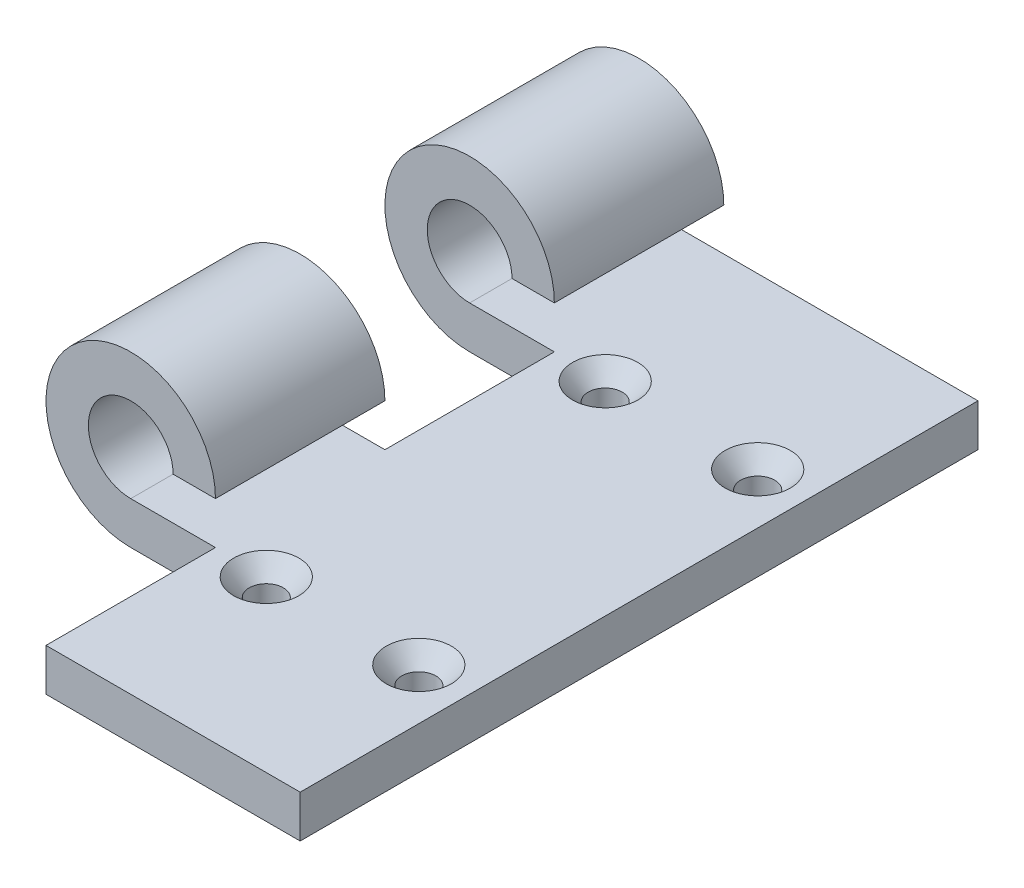
ISO-10303-21;
HEADER;
FILE_DESCRIPTION(('STEP AP214'),'2;1');
FILE_NAME('part.step','',(''),(''),'','','');
FILE_SCHEMA(('AUTOMOTIVE_DESIGN { 1 0 10303 214 1 1 1 1 }'));
ENDSEC;
DATA;
#1=APPLICATION_CONTEXT('core data for automotive mechanical design processes');
#2=APPLICATION_PROTOCOL_DEFINITION('international standard','automotive_design',2000,#1);
#3=PRODUCT_CONTEXT('',#1,'mechanical');
#4=PRODUCT('Part','Part','',(#3));
#5=PRODUCT_RELATED_PRODUCT_CATEGORY('part','',(#4));
#6=PRODUCT_DEFINITION_FORMATION('','',#4);
#7=PRODUCT_DEFINITION_CONTEXT('part definition',#1,'design');
#8=PRODUCT_DEFINITION('design','',#6,#7);
#9=PRODUCT_DEFINITION_SHAPE('','',#8);
#10=(LENGTH_UNIT() NAMED_UNIT(*) SI_UNIT(.MILLI.,.METRE.));
#11=(NAMED_UNIT(*) PLANE_ANGLE_UNIT() SI_UNIT($,.RADIAN.));
#12=(NAMED_UNIT(*) SI_UNIT($,.STERADIAN.) SOLID_ANGLE_UNIT());
#13=UNCERTAINTY_MEASURE_WITH_UNIT(LENGTH_MEASURE(1.E-05),#10,'distance_accuracy_value','');
#14=(GEOMETRIC_REPRESENTATION_CONTEXT(3) GLOBAL_UNCERTAINTY_ASSIGNED_CONTEXT((#13)) GLOBAL_UNIT_ASSIGNED_CONTEXT((#10,
#11,#12)) REPRESENTATION_CONTEXT('',''));
#15=CARTESIAN_POINT('',(0.,0.,0.));
#16=DIRECTION('',(0.,0.,1.));
#17=DIRECTION('',(1.,0.,0.));
#18=AXIS2_PLACEMENT_3D('',#15,#16,#17);
#19=CARTESIAN_POINT('',(43.18,-6.35,25.4));
#20=DIRECTION('',(0.,1.,0.));
#21=DIRECTION('',(0.,0.,1.));
#22=AXIS2_PLACEMENT_3D('',#19,#20,#21);
#23=CONICAL_SURFACE('',#22,4.8895,0.715584993317675);
#24=CARTESIAN_POINT('',(43.18,-9.03818089399406,25.4));
#25=DIRECTION('',(0.,1.,0.));
#26=DIRECTION('',(0.,0.,1.));
#27=AXIS2_PLACEMENT_3D('',#24,#25,#26);
#28=CIRCLE('',#27,2.5527);
#29=CARTESIAN_POINT('',(43.18,-9.03818089399406,27.9527));
#30=VERTEX_POINT('',#29);
#31=EDGE_CURVE('E11',#30,#30,#28,.T.);
#32=ORIENTED_EDGE('',*,*,#31,.F.);
#33=EDGE_LOOP('',(#32));
#34=FACE_BOUND('',#33,.T.);
#35=CARTESIAN_POINT('',(43.18,-6.35,25.4));
#36=DIRECTION('',(0.,1.,0.));
#37=DIRECTION('',(0.,0.,1.));
#38=AXIS2_PLACEMENT_3D('',#35,#36,#37);
#39=CIRCLE('',#38,4.8895);
#40=CARTESIAN_POINT('',(43.18,-6.35,30.2895));
#41=VERTEX_POINT('',#40);
#42=EDGE_CURVE('E260',#41,#41,#39,.T.);
#43=ORIENTED_EDGE('',*,*,#42,.T.);
#44=EDGE_LOOP('',(#43));
#45=FACE_BOUND('',#44,.T.);
#46=ADVANCED_FACE('F33',(#34,#45),#23,.F.);
#47=CARTESIAN_POINT('',(43.18,-6.35,25.4));
#48=DIRECTION('',(0.,1.,0.));
#49=DIRECTION('',(0.,0.,1.));
#50=AXIS2_PLACEMENT_3D('',#47,#48,#49);
#51=CYLINDRICAL_SURFACE('',#50,2.5527);
#52=CARTESIAN_POINT('',(43.18,-12.7,25.4));
#53=DIRECTION('',(0.,1.,0.));
#54=DIRECTION('',(0.,0.,1.));
#55=AXIS2_PLACEMENT_3D('',#52,#53,#54);
#56=CIRCLE('',#55,2.5527);
#57=CARTESIAN_POINT('',(43.18,-12.7,27.9527));
#58=VERTEX_POINT('',#57);
#59=EDGE_CURVE('E40',#58,#58,#56,.T.);
#60=ORIENTED_EDGE('',*,*,#59,.F.);
#61=EDGE_LOOP('',(#60));
#62=FACE_BOUND('',#61,.T.);
#63=ORIENTED_EDGE('',*,*,#31,.T.);
#64=EDGE_LOOP('',(#63));
#65=FACE_BOUND('',#64,.T.);
#66=ADVANCED_FACE('F266',(#62,#65),#51,.F.);
#67=CARTESIAN_POINT('',(43.18,-6.35,-25.4));
#68=DIRECTION('',(0.,1.,0.));
#69=DIRECTION('',(0.,0.,1.));
#70=AXIS2_PLACEMENT_3D('',#67,#68,#69);
#71=CONICAL_SURFACE('',#70,4.8895,0.715584993317675);
#72=CARTESIAN_POINT('',(43.18,-9.03818089399406,-25.4));
#73=DIRECTION('',(0.,1.,0.));
#74=DIRECTION('',(0.,0.,1.));
#75=AXIS2_PLACEMENT_3D('',#72,#73,#74);
#76=CIRCLE('',#75,2.5527);
#77=CARTESIAN_POINT('',(43.18,-9.03818089399406,-22.8473));
#78=VERTEX_POINT('',#77);
#79=EDGE_CURVE('E257',#78,#78,#76,.T.);
#80=ORIENTED_EDGE('',*,*,#79,.F.);
#81=EDGE_LOOP('',(#80));
#82=FACE_BOUND('',#81,.T.);
#83=CARTESIAN_POINT('',(43.18,-6.35,-25.4));
#84=DIRECTION('',(0.,1.,0.));
#85=DIRECTION('',(0.,0.,1.));
#86=AXIS2_PLACEMENT_3D('',#83,#84,#85);
#87=CIRCLE('',#86,4.8895);
#88=CARTESIAN_POINT('',(43.18,-6.35,-20.5105));
#89=VERTEX_POINT('',#88);
#90=EDGE_CURVE('E251',#89,#89,#87,.T.);
#91=ORIENTED_EDGE('',*,*,#90,.T.);
#92=EDGE_LOOP('',(#91));
#93=FACE_BOUND('',#92,.T.);
#94=ADVANCED_FACE('F269',(#82,#93),#71,.F.);
#95=CARTESIAN_POINT('',(43.18,-6.35,-25.4));
#96=DIRECTION('',(0.,1.,0.));
#97=DIRECTION('',(0.,0.,1.));
#98=AXIS2_PLACEMENT_3D('',#95,#96,#97);
#99=CYLINDRICAL_SURFACE('',#98,2.5527);
#100=CARTESIAN_POINT('',(43.18,-12.7,-25.4));
#101=DIRECTION('',(0.,1.,0.));
#102=DIRECTION('',(0.,0.,1.));
#103=AXIS2_PLACEMENT_3D('',#100,#101,#102);
#104=CIRCLE('',#103,2.5527);
#105=CARTESIAN_POINT('',(43.18,-12.7,-22.8473));
#106=VERTEX_POINT('',#105);
#107=EDGE_CURVE('E254',#106,#106,#104,.T.);
#108=ORIENTED_EDGE('',*,*,#107,.F.);
#109=EDGE_LOOP('',(#108));
#110=FACE_BOUND('',#109,.T.);
#111=ORIENTED_EDGE('',*,*,#79,.T.);
#112=EDGE_LOOP('',(#111));
#113=FACE_BOUND('',#112,.T.);
#114=ADVANCED_FACE('F299',(#110,#113),#99,.F.);
#115=CARTESIAN_POINT('',(0.,-12.7,50.8));
#116=DIRECTION('',(0.,-1.,0.));
#117=DIRECTION('',(0.,0.,-1.));
#118=AXIS2_PLACEMENT_3D('',#115,#116,#117);
#119=PLANE('',#118);
#120=CARTESIAN_POINT('',(20.32,-12.7,25.4));
#121=DIRECTION('',(0.,1.,0.));
#122=DIRECTION('',(0.,0.,1.));
#123=AXIS2_PLACEMENT_3D('',#120,#121,#122);
#124=CIRCLE('',#123,2.5527);
#125=CARTESIAN_POINT('',(20.32,-12.7,27.9527));
#126=VERTEX_POINT('',#125);
#127=EDGE_CURVE('E502',#126,#126,#124,.T.);
#128=ORIENTED_EDGE('',*,*,#127,.T.);
#129=EDGE_LOOP('',(#128));
#130=FACE_BOUND('',#129,.T.);
#131=DIRECTION('',(1.,0.,0.));
#132=VECTOR('',#131,1.);
#133=CARTESIAN_POINT('',(-12.7,-12.7,0.));
#134=LINE('',#133,#132);
#135=CARTESIAN_POINT('',(0.,-12.7,0.));
#136=VERTEX_POINT('',#135);
#137=CARTESIAN_POINT('',(12.7,-12.7,0.));
#138=VERTEX_POINT('',#137);
#139=EDGE_CURVE('E141',#136,#138,#134,.T.);
#140=ORIENTED_EDGE('',*,*,#139,.T.);
#141=DIRECTION('',(0.,0.,-1.));
#142=VECTOR('',#141,1.);
#143=CARTESIAN_POINT('',(12.7,-12.7,-25.4));
#144=LINE('',#143,#142);
#145=CARTESIAN_POINT('',(12.7,-12.7,-25.4));
#146=VERTEX_POINT('',#145);
#147=EDGE_CURVE('E135',#138,#146,#144,.T.);
#148=ORIENTED_EDGE('',*,*,#147,.T.);
#149=DIRECTION('',(-1.,0.,0.));
#150=VECTOR('',#149,1.);
#151=CARTESIAN_POINT('',(-12.7,-12.7,-25.4));
#152=LINE('',#151,#150);
#153=CARTESIAN_POINT('',(0.,-12.7,-25.4));
#154=VERTEX_POINT('',#153);
#155=EDGE_CURVE('E144',#146,#154,#152,.T.);
#156=ORIENTED_EDGE('',*,*,#155,.T.);
#157=DIRECTION('',(0.,0.,-1.));
#158=VECTOR('',#157,1.);
#159=CARTESIAN_POINT('',(0.,-12.7,50.8));
#160=LINE('',#159,#158);
#161=CARTESIAN_POINT('',(0.,-12.7,-50.8));
#162=VERTEX_POINT('',#161);
#163=EDGE_CURVE('E231',#154,#162,#160,.T.);
#164=ORIENTED_EDGE('',*,*,#163,.T.);
#165=DIRECTION('',(-1.,0.,0.));
#166=VECTOR('',#165,1.);
#167=CARTESIAN_POINT('',(0.,-12.7,-50.8));
#168=LINE('',#167,#166);
#169=CARTESIAN_POINT('',(50.8,-12.7,-50.8));
#170=VERTEX_POINT('',#169);
#171=EDGE_CURVE('E216',#170,#162,#168,.T.);
#172=ORIENTED_EDGE('',*,*,#171,.F.);
#173=DIRECTION('',(0.,0.,-1.));
#174=VECTOR('',#173,1.);
#175=CARTESIAN_POINT('',(50.8,-12.7,50.8));
#176=LINE('',#175,#174);
#177=CARTESIAN_POINT('',(50.8,-12.7,50.8));
#178=VERTEX_POINT('',#177);
#179=EDGE_CURVE('E229',#178,#170,#176,.T.);
#180=ORIENTED_EDGE('',*,*,#179,.F.);
#181=DIRECTION('',(-1.,0.,0.));
#182=VECTOR('',#181,1.);
#183=CARTESIAN_POINT('',(0.,-12.7,50.8));
#184=LINE('',#183,#182);
#185=CARTESIAN_POINT('',(12.7,-12.7,50.8));
#186=VERTEX_POINT('',#185);
#187=EDGE_CURVE('E197',#178,#186,#184,.T.);
#188=ORIENTED_EDGE('',*,*,#187,.T.);
#189=DIRECTION('',(0.,0.,-1.));
#190=VECTOR('',#189,1.);
#191=CARTESIAN_POINT('',(12.7,-12.7,25.4));
#192=LINE('',#191,#190);
#193=CARTESIAN_POINT('',(12.7,-12.7,25.4));
#194=VERTEX_POINT('',#193);
#195=EDGE_CURVE('E55',#186,#194,#192,.T.);
#196=ORIENTED_EDGE('',*,*,#195,.T.);
#197=DIRECTION('',(-1.,0.,0.));
#198=VECTOR('',#197,1.);
#199=CARTESIAN_POINT('',(-12.7,-12.7,25.4));
#200=LINE('',#199,#198);
#201=CARTESIAN_POINT('',(0.,-12.7,25.4));
#202=VERTEX_POINT('',#201);
#203=EDGE_CURVE('E177',#194,#202,#200,.T.);
#204=ORIENTED_EDGE('',*,*,#203,.T.);
#205=EDGE_CURVE('E232',#202,#136,#160,.T.);
#206=ORIENTED_EDGE('',*,*,#205,.T.);
#207=EDGE_LOOP('',(#140,#148,#156,#164,#172,#180,#188,#196,#204,#206));
#208=FACE_BOUND('',#207,.T.);
#209=CARTESIAN_POINT('',(20.32,-12.7,-25.4));
#210=DIRECTION('',(0.,1.,0.));
#211=DIRECTION('',(0.,0.,1.));
#212=AXIS2_PLACEMENT_3D('',#209,#210,#211);
#213=CIRCLE('',#212,2.5527);
#214=CARTESIAN_POINT('',(20.32,-12.7,-22.8473));
#215=VERTEX_POINT('',#214);
#216=EDGE_CURVE('E154',#215,#215,#213,.T.);
#217=ORIENTED_EDGE('',*,*,#216,.T.);
#218=EDGE_LOOP('',(#217));
#219=FACE_BOUND('',#218,.T.);
#220=ORIENTED_EDGE('',*,*,#107,.T.);
#221=EDGE_LOOP('',(#220));
#222=FACE_BOUND('',#221,.T.);
#223=ORIENTED_EDGE('',*,*,#59,.T.);
#224=EDGE_LOOP('',(#223));
#225=FACE_BOUND('',#224,.T.);
#226=ADVANCED_FACE('F151',(#130,#208,#219,#222,#225),#119,.T.);
#227=CARTESIAN_POINT('',(0.,0.,50.8));
#228=DIRECTION('',(0.,0.,-1.));
#229=DIRECTION('',(-1.,0.,0.));
#230=AXIS2_PLACEMENT_3D('',#227,#228,#229);
#231=CYLINDRICAL_SURFACE('',#230,6.35);
#232=DIRECTION('',(0.,0.,-1.));
#233=VECTOR('',#232,1.);
#234=CARTESIAN_POINT('',(0.,-6.35,50.8));
#235=LINE('',#234,#233);
#236=CARTESIAN_POINT('',(0.,-6.35,25.4));
#237=VERTEX_POINT('',#236);
#238=CARTESIAN_POINT('',(0.,-6.35,0.));
#239=VERTEX_POINT('',#238);
#240=EDGE_CURVE('E224',#237,#239,#235,.T.);
#241=ORIENTED_EDGE('',*,*,#240,.T.);
#242=CARTESIAN_POINT('',(0.,0.,0.));
#243=DIRECTION('',(0.,0.,1.));
#244=DIRECTION('',(1.,0.,0.));
#245=AXIS2_PLACEMENT_3D('',#242,#243,#244);
#246=CIRCLE('',#245,6.35);
#247=CARTESIAN_POINT('',(6.35,0.,0.));
#248=VERTEX_POINT('',#247);
#249=EDGE_CURVE('E169',#239,#248,#246,.F.);
#250=ORIENTED_EDGE('',*,*,#249,.T.);
#251=DIRECTION('',(0.,0.,-1.));
#252=VECTOR('',#251,1.);
#253=CARTESIAN_POINT('',(6.35,0.,50.8));
#254=LINE('',#253,#252);
#255=CARTESIAN_POINT('',(6.35,0.,25.4));
#256=VERTEX_POINT('',#255);
#257=EDGE_CURVE('E239',#256,#248,#254,.T.);
#258=ORIENTED_EDGE('',*,*,#257,.F.);
#259=CARTESIAN_POINT('',(0.,0.,25.4));
#260=DIRECTION('',(0.,0.,-1.));
#261=DIRECTION('',(-1.,0.,0.));
#262=AXIS2_PLACEMENT_3D('',#259,#260,#261);
#263=CIRCLE('',#262,6.35);
#264=EDGE_CURVE('E188',#256,#237,#263,.F.);
#265=ORIENTED_EDGE('',*,*,#264,.T.);
#266=EDGE_LOOP('',(#241,#250,#258,#265));
#267=FACE_BOUND('',#266,.T.);
#268=ADVANCED_FACE('F298',(#267),#231,.F.);
#269=CARTESIAN_POINT('',(12.7,0.,50.8));
#270=DIRECTION('',(0.,-1.,0.));
#271=DIRECTION('',(1.,0.,0.));
#272=AXIS2_PLACEMENT_3D('',#269,#270,#271);
#273=PLANE('',#272);
#274=DIRECTION('',(-1.,0.,0.));
#275=VECTOR('',#274,1.);
#276=CARTESIAN_POINT('',(12.7,0.,0.));
#277=LINE('',#276,#275);
#278=CARTESIAN_POINT('',(12.7,0.,0.));
#279=VERTEX_POINT('',#278);
#280=EDGE_CURVE('E172',#279,#248,#277,.T.);
#281=ORIENTED_EDGE('',*,*,#280,.F.);
#282=DIRECTION('',(0.,0.,-1.));
#283=VECTOR('',#282,1.);
#284=CARTESIAN_POINT('',(12.7,0.,50.8));
#285=LINE('',#284,#283);
#286=CARTESIAN_POINT('',(12.7,0.,25.4));
#287=VERTEX_POINT('',#286);
#288=EDGE_CURVE('E235',#287,#279,#285,.T.);
#289=ORIENTED_EDGE('',*,*,#288,.F.);
#290=DIRECTION('',(1.,0.,0.));
#291=VECTOR('',#290,1.);
#292=CARTESIAN_POINT('',(12.7,0.,25.4));
#293=LINE('',#292,#291);
#294=EDGE_CURVE('E191',#256,#287,#293,.T.);
#295=ORIENTED_EDGE('',*,*,#294,.F.);
#296=ORIENTED_EDGE('',*,*,#257,.T.);
#297=EDGE_LOOP('',(#281,#289,#295,#296));
#298=FACE_BOUND('',#297,.T.);
#299=ADVANCED_FACE('F310',(#298),#273,.T.);
#300=CARTESIAN_POINT('',(0.,0.,50.8));
#301=DIRECTION('',(0.,0.,-1.));
#302=DIRECTION('',(-1.,0.,0.));
#303=AXIS2_PLACEMENT_3D('',#300,#301,#302);
#304=CYLINDRICAL_SURFACE('',#303,12.7);
#305=CARTESIAN_POINT('',(0.,0.,-25.4));
#306=DIRECTION('',(0.,0.,-1.));
#307=DIRECTION('',(-1.,0.,0.));
#308=AXIS2_PLACEMENT_3D('',#305,#306,#307);
#309=CIRCLE('',#308,12.7);
#310=CARTESIAN_POINT('',(12.7,0.,-25.4));
#311=VERTEX_POINT('',#310);
#312=EDGE_CURVE('E147',#311,#154,#309,.F.);
#313=ORIENTED_EDGE('',*,*,#312,.F.);
#314=CARTESIAN_POINT('',(12.7,0.,-50.8));
#315=VERTEX_POINT('',#314);
#316=EDGE_CURVE('E234',#311,#315,#285,.T.);
#317=ORIENTED_EDGE('',*,*,#316,.T.);
#318=CARTESIAN_POINT('',(0.,0.,-50.8));
#319=DIRECTION('',(0.,0.,-1.));
#320=DIRECTION('',(-1.,0.,0.));
#321=AXIS2_PLACEMENT_3D('',#318,#319,#320);
#322=CIRCLE('',#321,12.7);
#323=EDGE_CURVE('E213',#162,#315,#322,.T.);
#324=ORIENTED_EDGE('',*,*,#323,.F.);
#325=ORIENTED_EDGE('',*,*,#163,.F.);
#326=EDGE_LOOP('',(#313,#317,#324,#325));
#327=FACE_BOUND('',#326,.T.);
#328=ADVANCED_FACE('F305',(#327),#304,.T.);
#329=CARTESIAN_POINT('',(6.35,0.,-25.4));
#330=VERTEX_POINT('',#329);
#331=CARTESIAN_POINT('',(6.35,0.,-50.8));
#332=VERTEX_POINT('',#331);
#333=EDGE_CURVE('E238',#330,#332,#254,.T.);
#334=ORIENTED_EDGE('',*,*,#333,.F.);
#335=CARTESIAN_POINT('',(0.,0.,-25.4));
#336=DIRECTION('',(0.,0.,-1.));
#337=DIRECTION('',(-1.,0.,0.));
#338=AXIS2_PLACEMENT_3D('',#335,#336,#337);
#339=CIRCLE('',#338,6.35);
#340=CARTESIAN_POINT('',(0.,-6.35,-25.4));
#341=VERTEX_POINT('',#340);
#342=EDGE_CURVE('E162',#330,#341,#339,.F.);
#343=ORIENTED_EDGE('',*,*,#342,.T.);
#344=CARTESIAN_POINT('',(0.,-6.35,-50.8));
#345=VERTEX_POINT('',#344);
#346=EDGE_CURVE('E207',#341,#345,#235,.T.);
#347=ORIENTED_EDGE('',*,*,#346,.T.);
#348=CARTESIAN_POINT('',(0.,0.,-50.8));
#349=DIRECTION('',(0.,0.,1.));
#350=DIRECTION('',(1.,0.,0.));
#351=AXIS2_PLACEMENT_3D('',#348,#349,#350);
#352=CIRCLE('',#351,6.35);
#353=EDGE_CURVE('E196',#345,#332,#352,.F.);
#354=ORIENTED_EDGE('',*,*,#353,.T.);
#355=EDGE_LOOP('',(#334,#343,#347,#354));
#356=FACE_BOUND('',#355,.T.);
#357=ADVANCED_FACE('F308',(#356),#231,.F.);
#358=DIRECTION('',(1.,0.,0.));
#359=VECTOR('',#358,1.);
#360=CARTESIAN_POINT('',(12.7,0.,-25.4));
#361=LINE('',#360,#359);
#362=EDGE_CURVE('E166',#330,#311,#361,.T.);
#363=ORIENTED_EDGE('',*,*,#362,.F.);
#364=ORIENTED_EDGE('',*,*,#333,.T.);
#365=DIRECTION('',(-1.,0.,0.));
#366=VECTOR('',#365,1.);
#367=CARTESIAN_POINT('',(12.7,0.,-50.8));
#368=LINE('',#367,#366);
#369=EDGE_CURVE('E210',#315,#332,#368,.T.);
#370=ORIENTED_EDGE('',*,*,#369,.F.);
#371=ORIENTED_EDGE('',*,*,#316,.F.);
#372=EDGE_LOOP('',(#363,#364,#370,#371));
#373=FACE_BOUND('',#372,.T.);
#374=ADVANCED_FACE('F303',(#373),#273,.T.);
#375=CARTESIAN_POINT('',(0.,0.,0.));
#376=DIRECTION('',(0.,0.,1.));
#377=DIRECTION('',(1.,0.,0.));
#378=AXIS2_PLACEMENT_3D('',#375,#376,#377);
#379=CIRCLE('',#378,12.7);
#380=EDGE_CURVE('E174',#136,#279,#379,.F.);
#381=ORIENTED_EDGE('',*,*,#380,.F.);
#382=ORIENTED_EDGE('',*,*,#205,.F.);
#383=CARTESIAN_POINT('',(0.,0.,25.4));
#384=DIRECTION('',(0.,0.,-1.));
#385=DIRECTION('',(-1.,0.,0.));
#386=AXIS2_PLACEMENT_3D('',#383,#384,#385);
#387=CIRCLE('',#386,12.7);
#388=EDGE_CURVE('E194',#287,#202,#387,.F.);
#389=ORIENTED_EDGE('',*,*,#388,.F.);
#390=ORIENTED_EDGE('',*,*,#288,.T.);
#391=EDGE_LOOP('',(#381,#382,#389,#390));
#392=FACE_BOUND('',#391,.T.);
#393=ADVANCED_FACE('F289',(#392),#304,.T.);
#394=CARTESIAN_POINT('',(50.8,-6.35,50.8));
#395=DIRECTION('',(1.,0.,0.));
#396=DIRECTION('',(0.,0.,-1.));
#397=AXIS2_PLACEMENT_3D('',#394,#395,#396);
#398=PLANE('',#397);
#399=DIRECTION('',(0.,-1.,0.));
#400=VECTOR('',#399,1.);
#401=CARTESIAN_POINT('',(50.8,-6.35,-50.8));
#402=LINE('',#401,#400);
#403=CARTESIAN_POINT('',(50.8,-6.35,-50.8));
#404=VERTEX_POINT('',#403);
#405=EDGE_CURVE('E219',#404,#170,#402,.T.);
#406=ORIENTED_EDGE('',*,*,#405,.F.);
#407=DIRECTION('',(0.,0.,-1.));
#408=VECTOR('',#407,1.);
#409=CARTESIAN_POINT('',(50.8,-6.35,50.8));
#410=LINE('',#409,#408);
#411=CARTESIAN_POINT('',(50.8,-6.35,50.8));
#412=VERTEX_POINT('',#411);
#413=EDGE_CURVE('E227',#412,#404,#410,.T.);
#414=ORIENTED_EDGE('',*,*,#413,.F.);
#415=DIRECTION('',(0.,-1.,0.));
#416=VECTOR('',#415,1.);
#417=CARTESIAN_POINT('',(50.8,-6.35,50.8));
#418=LINE('',#417,#416);
#419=EDGE_CURVE('E200',#412,#178,#418,.T.);
#420=ORIENTED_EDGE('',*,*,#419,.T.);
#421=ORIENTED_EDGE('',*,*,#179,.T.);
#422=EDGE_LOOP('',(#406,#414,#420,#421));
#423=FACE_BOUND('',#422,.T.);
#424=ADVANCED_FACE('F279',(#423),#398,.T.);
#425=CARTESIAN_POINT('',(0.,-6.35,50.8));
#426=DIRECTION('',(0.,-1.,0.));
#427=DIRECTION('',(0.,0.,-1.));
#428=AXIS2_PLACEMENT_3D('',#425,#426,#427);
#429=PLANE('',#428);
#430=CARTESIAN_POINT('',(20.32,-6.35,25.4));
#431=DIRECTION('',(0.,1.,0.));
#432=DIRECTION('',(0.,0.,1.));
#433=AXIS2_PLACEMENT_3D('',#430,#431,#432);
#434=CIRCLE('',#433,4.8895);
#435=CARTESIAN_POINT('',(20.32,-6.35,30.2895));
#436=VERTEX_POINT('',#435);
#437=EDGE_CURVE('E501',#436,#436,#434,.T.);
#438=ORIENTED_EDGE('',*,*,#437,.F.);
#439=EDGE_LOOP('',(#438));
#440=FACE_BOUND('',#439,.T.);
#441=CARTESIAN_POINT('',(20.32,-6.35,-25.4));
#442=DIRECTION('',(0.,1.,0.));
#443=DIRECTION('',(0.,0.,1.));
#444=AXIS2_PLACEMENT_3D('',#441,#442,#443);
#445=CIRCLE('',#444,4.8895);
#446=CARTESIAN_POINT('',(20.32,-6.35,-20.5105));
#447=VERTEX_POINT('',#446);
#448=EDGE_CURVE('E508',#447,#447,#445,.T.);
#449=ORIENTED_EDGE('',*,*,#448,.F.);
#450=EDGE_LOOP('',(#449));
#451=FACE_BOUND('',#450,.T.);
#452=DIRECTION('',(0.,0.,1.));
#453=VECTOR('',#452,1.);
#454=CARTESIAN_POINT('',(12.7,-6.35,50.8));
#455=LINE('',#454,#453);
#456=CARTESIAN_POINT('',(12.7,-6.35,-25.4));
#457=VERTEX_POINT('',#456);
#458=CARTESIAN_POINT('',(12.7,-6.35,0.));
#459=VERTEX_POINT('',#458);
#460=EDGE_CURVE('E138',#457,#459,#455,.T.);
#461=ORIENTED_EDGE('',*,*,#460,.T.);
#462=DIRECTION('',(-1.,0.,0.));
#463=VECTOR('',#462,1.);
#464=CARTESIAN_POINT('',(0.,-6.35,0.));
#465=LINE('',#464,#463);
#466=EDGE_CURVE('E248',#459,#239,#465,.T.);
#467=ORIENTED_EDGE('',*,*,#466,.T.);
#468=ORIENTED_EDGE('',*,*,#240,.F.);
#469=DIRECTION('',(1.,0.,0.));
#470=VECTOR('',#469,1.);
#471=CARTESIAN_POINT('',(0.,-6.35,25.4));
#472=LINE('',#471,#470);
#473=CARTESIAN_POINT('',(12.7,-6.35,25.4));
#474=VERTEX_POINT('',#473);
#475=EDGE_CURVE('E242',#237,#474,#472,.T.);
#476=ORIENTED_EDGE('',*,*,#475,.T.);
#477=DIRECTION('',(0.,0.,1.));
#478=VECTOR('',#477,1.);
#479=CARTESIAN_POINT('',(12.7,-6.35,50.8));
#480=LINE('',#479,#478);
#481=CARTESIAN_POINT('',(12.7,-6.35,50.8));
#482=VERTEX_POINT('',#481);
#483=EDGE_CURVE('E183',#474,#482,#480,.T.);
#484=ORIENTED_EDGE('',*,*,#483,.T.);
#485=DIRECTION('',(1.,0.,0.));
#486=VECTOR('',#485,1.);
#487=CARTESIAN_POINT('',(0.,-6.35,50.8));
#488=LINE('',#487,#486);
#489=EDGE_CURVE('E204',#412,#482,#488,.F.);
#490=ORIENTED_EDGE('',*,*,#489,.F.);
#491=ORIENTED_EDGE('',*,*,#413,.T.);
#492=DIRECTION('',(1.,0.,0.));
#493=VECTOR('',#492,1.);
#494=CARTESIAN_POINT('',(0.,-6.35,-50.8));
#495=LINE('',#494,#493);
#496=EDGE_CURVE('E201',#404,#345,#495,.F.);
#497=ORIENTED_EDGE('',*,*,#496,.T.);
#498=ORIENTED_EDGE('',*,*,#346,.F.);
#499=DIRECTION('',(1.,0.,0.));
#500=VECTOR('',#499,1.);
#501=CARTESIAN_POINT('',(0.,-6.35,-25.4));
#502=LINE('',#501,#500);
#503=EDGE_CURVE('E245',#341,#457,#502,.T.);
#504=ORIENTED_EDGE('',*,*,#503,.T.);
#505=EDGE_LOOP('',(#461,#467,#468,#476,#484,#490,#491,#497,#498,#504));
#506=FACE_BOUND('',#505,.T.);
#507=ORIENTED_EDGE('',*,*,#90,.F.);
#508=EDGE_LOOP('',(#507));
#509=FACE_BOUND('',#508,.T.);
#510=ORIENTED_EDGE('',*,*,#42,.F.);
#511=EDGE_LOOP('',(#510));
#512=FACE_BOUND('',#511,.T.);
#513=ADVANCED_FACE('F276',(#440,#451,#506,#509,#512),#429,.F.);
#514=CARTESIAN_POINT('',(0.,0.,50.8));
#515=DIRECTION('',(0.,0.,1.));
#516=DIRECTION('',(1.,0.,0.));
#517=AXIS2_PLACEMENT_3D('',#514,#515,#516);
#518=PLANE('',#517);
#519=DIRECTION('',(0.,1.,0.));
#520=VECTOR('',#519,1.);
#521=CARTESIAN_POINT('',(12.7,-12.7,50.8));
#522=LINE('',#521,#520);
#523=EDGE_CURVE('E181',#186,#482,#522,.T.);
#524=ORIENTED_EDGE('',*,*,#523,.F.);
#525=ORIENTED_EDGE('',*,*,#187,.F.);
#526=ORIENTED_EDGE('',*,*,#419,.F.);
#527=ORIENTED_EDGE('',*,*,#489,.T.);
#528=EDGE_LOOP('',(#524,#525,#526,#527));
#529=FACE_BOUND('',#528,.T.);
#530=ADVANCED_FACE('F278',(#529),#518,.T.);
#531=CARTESIAN_POINT('',(0.,0.,-50.8));
#532=DIRECTION('',(0.,0.,1.));
#533=DIRECTION('',(1.,0.,0.));
#534=AXIS2_PLACEMENT_3D('',#531,#532,#533);
#535=PLANE('',#534);
#536=ORIENTED_EDGE('',*,*,#353,.F.);
#537=ORIENTED_EDGE('',*,*,#496,.F.);
#538=ORIENTED_EDGE('',*,*,#405,.T.);
#539=ORIENTED_EDGE('',*,*,#171,.T.);
#540=ORIENTED_EDGE('',*,*,#323,.T.);
#541=ORIENTED_EDGE('',*,*,#369,.T.);
#542=EDGE_LOOP('',(#536,#537,#538,#539,#540,#541));
#543=FACE_BOUND('',#542,.T.);
#544=ADVANCED_FACE('F286',(#543),#535,.F.);
#545=CARTESIAN_POINT('',(12.7,-12.7,25.4));
#546=DIRECTION('',(1.,0.,0.));
#547=DIRECTION('',(0.,0.,-1.));
#548=AXIS2_PLACEMENT_3D('',#545,#546,#547);
#549=PLANE('',#548);
#550=DIRECTION('',(0.,1.,0.));
#551=VECTOR('',#550,1.);
#552=CARTESIAN_POINT('',(12.7,-12.7,25.4));
#553=LINE('',#552,#551);
#554=EDGE_CURVE('E180',#194,#474,#553,.T.);
#555=ORIENTED_EDGE('',*,*,#554,.F.);
#556=ORIENTED_EDGE('',*,*,#195,.F.);
#557=ORIENTED_EDGE('',*,*,#523,.T.);
#558=ORIENTED_EDGE('',*,*,#483,.F.);
#559=EDGE_LOOP('',(#555,#556,#557,#558));
#560=FACE_BOUND('',#559,.T.);
#561=ADVANCED_FACE('F382',(#560),#549,.F.);
#562=CARTESIAN_POINT('',(-12.7,-12.7,25.4));
#563=DIRECTION('',(0.,0.,-1.));
#564=DIRECTION('',(-1.,0.,0.));
#565=AXIS2_PLACEMENT_3D('',#562,#563,#564);
#566=PLANE('',#565);
#567=ORIENTED_EDGE('',*,*,#388,.T.);
#568=ORIENTED_EDGE('',*,*,#203,.F.);
#569=ORIENTED_EDGE('',*,*,#554,.T.);
#570=ORIENTED_EDGE('',*,*,#475,.F.);
#571=ORIENTED_EDGE('',*,*,#264,.F.);
#572=ORIENTED_EDGE('',*,*,#294,.T.);
#573=EDGE_LOOP('',(#567,#568,#569,#570,#571,#572));
#574=FACE_BOUND('',#573,.T.);
#575=ADVANCED_FACE('F396',(#574),#566,.F.);
#576=CARTESIAN_POINT('',(12.7,-12.7,-25.4));
#577=DIRECTION('',(1.,0.,0.));
#578=DIRECTION('',(0.,0.,-1.));
#579=AXIS2_PLACEMENT_3D('',#576,#577,#578);
#580=PLANE('',#579);
#581=DIRECTION('',(0.,1.,0.));
#582=VECTOR('',#581,1.);
#583=CARTESIAN_POINT('',(12.7,-12.7,-25.4));
#584=LINE('',#583,#582);
#585=EDGE_CURVE('E47',#146,#457,#584,.T.);
#586=ORIENTED_EDGE('',*,*,#585,.F.);
#587=ORIENTED_EDGE('',*,*,#147,.F.);
#588=DIRECTION('',(0.,1.,0.));
#589=VECTOR('',#588,1.);
#590=CARTESIAN_POINT('',(12.7,-12.7,0.));
#591=LINE('',#590,#589);
#592=EDGE_CURVE('E140',#138,#459,#591,.T.);
#593=ORIENTED_EDGE('',*,*,#592,.T.);
#594=ORIENTED_EDGE('',*,*,#460,.F.);
#595=EDGE_LOOP('',(#586,#587,#593,#594));
#596=FACE_BOUND('',#595,.T.);
#597=ADVANCED_FACE('F132',(#596),#580,.F.);
#598=CARTESIAN_POINT('',(-12.7,-12.7,0.));
#599=DIRECTION('',(0.,0.,1.));
#600=DIRECTION('',(1.,0.,0.));
#601=AXIS2_PLACEMENT_3D('',#598,#599,#600);
#602=PLANE('',#601);
#603=ORIENTED_EDGE('',*,*,#380,.T.);
#604=ORIENTED_EDGE('',*,*,#280,.T.);
#605=ORIENTED_EDGE('',*,*,#249,.F.);
#606=ORIENTED_EDGE('',*,*,#466,.F.);
#607=ORIENTED_EDGE('',*,*,#592,.F.);
#608=ORIENTED_EDGE('',*,*,#139,.F.);
#609=EDGE_LOOP('',(#603,#604,#605,#606,#607,#608));
#610=FACE_BOUND('',#609,.T.);
#611=ADVANCED_FACE('F412',(#610),#602,.F.);
#612=CARTESIAN_POINT('',(-12.7,-12.7,-25.4));
#613=DIRECTION('',(0.,0.,-1.));
#614=DIRECTION('',(-1.,0.,0.));
#615=AXIS2_PLACEMENT_3D('',#612,#613,#614);
#616=PLANE('',#615);
#617=ORIENTED_EDGE('',*,*,#312,.T.);
#618=ORIENTED_EDGE('',*,*,#155,.F.);
#619=ORIENTED_EDGE('',*,*,#585,.T.);
#620=ORIENTED_EDGE('',*,*,#503,.F.);
#621=ORIENTED_EDGE('',*,*,#342,.F.);
#622=ORIENTED_EDGE('',*,*,#362,.T.);
#623=EDGE_LOOP('',(#617,#618,#619,#620,#621,#622));
#624=FACE_BOUND('',#623,.T.);
#625=ADVANCED_FACE('F145',(#624),#616,.F.);
#626=CARTESIAN_POINT('',(20.32,-6.35,-25.4));
#627=DIRECTION('',(0.,1.,0.));
#628=DIRECTION('',(0.,0.,1.));
#629=AXIS2_PLACEMENT_3D('',#626,#627,#628);
#630=CYLINDRICAL_SURFACE('',#629,2.5527);
#631=ORIENTED_EDGE('',*,*,#216,.F.);
#632=EDGE_LOOP('',(#631));
#633=FACE_BOUND('',#632,.T.);
#634=CARTESIAN_POINT('',(20.32,-9.03818089399406,-25.4));
#635=DIRECTION('',(0.,1.,0.));
#636=DIRECTION('',(0.,0.,1.));
#637=AXIS2_PLACEMENT_3D('',#634,#635,#636);
#638=CIRCLE('',#637,2.5527);
#639=CARTESIAN_POINT('',(20.32,-9.03818089399406,-22.8473));
#640=VERTEX_POINT('',#639);
#641=EDGE_CURVE('E157',#640,#640,#638,.T.);
#642=ORIENTED_EDGE('',*,*,#641,.T.);
#643=EDGE_LOOP('',(#642));
#644=FACE_BOUND('',#643,.T.);
#645=ADVANCED_FACE('F426',(#633,#644),#630,.F.);
#646=CARTESIAN_POINT('',(20.32,-6.35,-25.4));
#647=DIRECTION('',(0.,1.,0.));
#648=DIRECTION('',(0.,0.,1.));
#649=AXIS2_PLACEMENT_3D('',#646,#647,#648);
#650=CONICAL_SURFACE('',#649,4.8895,0.715584993317675);
#651=ORIENTED_EDGE('',*,*,#641,.F.);
#652=EDGE_LOOP('',(#651));
#653=FACE_BOUND('',#652,.T.);
#654=ORIENTED_EDGE('',*,*,#448,.T.);
#655=EDGE_LOOP('',(#654));
#656=FACE_BOUND('',#655,.T.);
#657=ADVANCED_FACE('F433',(#653,#656),#650,.F.);
#658=CARTESIAN_POINT('',(20.32,-6.35,25.4));
#659=DIRECTION('',(0.,1.,0.));
#660=DIRECTION('',(0.,0.,1.));
#661=AXIS2_PLACEMENT_3D('',#658,#659,#660);
#662=CYLINDRICAL_SURFACE('',#661,2.5527);
#663=ORIENTED_EDGE('',*,*,#127,.F.);
#664=EDGE_LOOP('',(#663));
#665=FACE_BOUND('',#664,.T.);
#666=CARTESIAN_POINT('',(20.32,-9.03818089399406,25.4));
#667=DIRECTION('',(0.,1.,0.));
#668=DIRECTION('',(0.,0.,1.));
#669=AXIS2_PLACEMENT_3D('',#666,#667,#668);
#670=CIRCLE('',#669,2.5527);
#671=CARTESIAN_POINT('',(20.32,-9.03818089399406,27.9527));
#672=VERTEX_POINT('',#671);
#673=EDGE_CURVE('E499',#672,#672,#670,.T.);
#674=ORIENTED_EDGE('',*,*,#673,.T.);
#675=EDGE_LOOP('',(#674));
#676=FACE_BOUND('',#675,.T.);
#677=ADVANCED_FACE('F441',(#665,#676),#662,.F.);
#678=CARTESIAN_POINT('',(20.32,-6.35,25.4));
#679=DIRECTION('',(0.,1.,0.));
#680=DIRECTION('',(0.,0.,1.));
#681=AXIS2_PLACEMENT_3D('',#678,#679,#680);
#682=CONICAL_SURFACE('',#681,4.8895,0.715584993317675);
#683=ORIENTED_EDGE('',*,*,#673,.F.);
#684=EDGE_LOOP('',(#683));
#685=FACE_BOUND('',#684,.T.);
#686=ORIENTED_EDGE('',*,*,#437,.T.);
#687=EDGE_LOOP('',(#686));
#688=FACE_BOUND('',#687,.T.);
#689=ADVANCED_FACE('F450',(#685,#688),#682,.F.);
#690=CLOSED_SHELL('',(#46,#66,#94,#114,#226,#268,#299,#328,#357,#374,#393,#424,#513,#530,#544,
#561,#575,#597,#611,#625,#645,#657,#677,#689));
#691=MANIFOLD_SOLID_BREP('B2',#690);
#692=ADVANCED_BREP_SHAPE_REPRESENTATION('',(#18,#691),#14);
#693=SHAPE_DEFINITION_REPRESENTATION(#9,#692);
ENDSEC;
END-ISO-10303-21;
